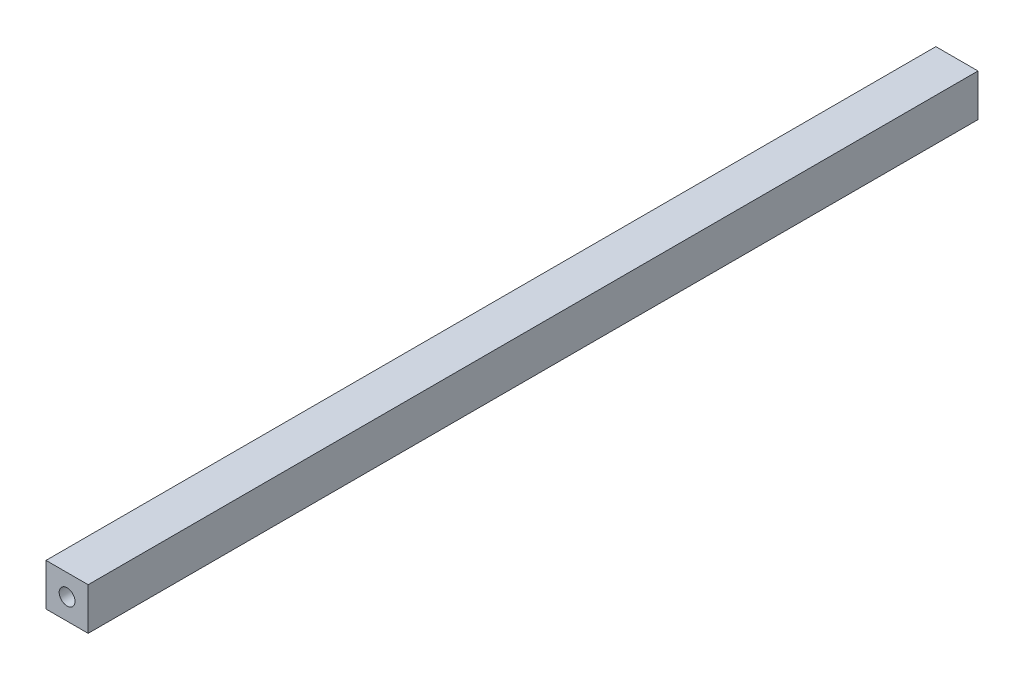
ISO-10303-21;
HEADER;
FILE_DESCRIPTION(('STEP AP214'),'2;1');
FILE_NAME('part.step','',(''),(''),'','','');
FILE_SCHEMA(('AUTOMOTIVE_DESIGN { 1 0 10303 214 1 1 1 1 }'));
ENDSEC;
DATA;
#1=APPLICATION_CONTEXT('core data for automotive mechanical design processes');
#2=APPLICATION_PROTOCOL_DEFINITION('international standard','automotive_design',2000,#1);
#3=PRODUCT_CONTEXT('',#1,'mechanical');
#4=PRODUCT('Part','Part','',(#3));
#5=PRODUCT_RELATED_PRODUCT_CATEGORY('part','',(#4));
#6=PRODUCT_DEFINITION_FORMATION('','',#4);
#7=PRODUCT_DEFINITION_CONTEXT('part definition',#1,'design');
#8=PRODUCT_DEFINITION('design','',#6,#7);
#9=PRODUCT_DEFINITION_SHAPE('','',#8);
#10=(LENGTH_UNIT() NAMED_UNIT(*) SI_UNIT(.MILLI.,.METRE.));
#11=(NAMED_UNIT(*) PLANE_ANGLE_UNIT() SI_UNIT($,.RADIAN.));
#12=(NAMED_UNIT(*) SI_UNIT($,.STERADIAN.) SOLID_ANGLE_UNIT());
#13=UNCERTAINTY_MEASURE_WITH_UNIT(LENGTH_MEASURE(1.E-05),#10,'distance_accuracy_value','');
#14=(GEOMETRIC_REPRESENTATION_CONTEXT(3) GLOBAL_UNCERTAINTY_ASSIGNED_CONTEXT((#13)) GLOBAL_UNIT_ASSIGNED_CONTEXT((#10,
#11,#12)) REPRESENTATION_CONTEXT('',''));
#15=CARTESIAN_POINT('',(0.,0.,0.));
#16=DIRECTION('',(0.,0.,1.));
#17=DIRECTION('',(1.,0.,0.));
#18=AXIS2_PLACEMENT_3D('',#15,#16,#17);
#19=CARTESIAN_POINT('',(0.,0.,536.194));
#20=DIRECTION('',(1.,0.,0.));
#21=DIRECTION('',(0.,0.,-1.));
#22=AXIS2_PLACEMENT_3D('',#19,#20,#21);
#23=PLANE('',#22);
#24=DIRECTION('',(0.,-1.,0.));
#25=VECTOR('',#24,1.);
#26=CARTESIAN_POINT('',(0.,0.,0.));
#27=LINE('',#26,#25);
#28=CARTESIAN_POINT('',(0.,25.4,0.));
#29=VERTEX_POINT('',#28);
#30=CARTESIAN_POINT('',(0.,0.,0.));
#31=VERTEX_POINT('',#30);
#32=EDGE_CURVE('E108',#29,#31,#27,.T.);
#33=ORIENTED_EDGE('',*,*,#32,.T.);
#34=DIRECTION('',(0.,0.,-1.));
#35=VECTOR('',#34,1.);
#36=CARTESIAN_POINT('',(0.,0.,536.194));
#37=LINE('',#36,#35);
#38=CARTESIAN_POINT('',(0.,0.,536.194));
#39=VERTEX_POINT('',#38);
#40=EDGE_CURVE('E11',#39,#31,#37,.T.);
#41=ORIENTED_EDGE('',*,*,#40,.F.);
#42=DIRECTION('',(0.,-1.,0.));
#43=VECTOR('',#42,1.);
#44=CARTESIAN_POINT('',(0.,0.,536.194));
#45=LINE('',#44,#43);
#46=CARTESIAN_POINT('',(0.,25.4,536.194));
#47=VERTEX_POINT('',#46);
#48=EDGE_CURVE('E109',#47,#39,#45,.T.);
#49=ORIENTED_EDGE('',*,*,#48,.F.);
#50=DIRECTION('',(0.,0.,-1.));
#51=VECTOR('',#50,1.);
#52=CARTESIAN_POINT('',(0.,25.4,536.194));
#53=LINE('',#52,#51);
#54=EDGE_CURVE('E115',#47,#29,#53,.T.);
#55=ORIENTED_EDGE('',*,*,#54,.T.);
#56=EDGE_LOOP('',(#33,#41,#49,#55));
#57=FACE_BOUND('',#56,.T.);
#58=ADVANCED_FACE('F33',(#57),#23,.F.);
#59=CARTESIAN_POINT('',(0.,0.,536.194));
#60=DIRECTION('',(0.,1.,0.));
#61=DIRECTION('',(0.,0.,1.));
#62=AXIS2_PLACEMENT_3D('',#59,#60,#61);
#63=PLANE('',#62);
#64=DIRECTION('',(1.,0.,0.));
#65=VECTOR('',#64,1.);
#66=CARTESIAN_POINT('',(0.,0.,0.));
#67=LINE('',#66,#65);
#68=CARTESIAN_POINT('',(25.4,0.,0.));
#69=VERTEX_POINT('',#68);
#70=EDGE_CURVE('E118',#31,#69,#67,.T.);
#71=ORIENTED_EDGE('',*,*,#70,.T.);
#72=DIRECTION('',(0.,0.,-1.));
#73=VECTOR('',#72,1.);
#74=CARTESIAN_POINT('',(25.4,0.,536.194));
#75=LINE('',#74,#73);
#76=CARTESIAN_POINT('',(25.4,0.,536.194));
#77=VERTEX_POINT('',#76);
#78=EDGE_CURVE('E41',#77,#69,#75,.T.);
#79=ORIENTED_EDGE('',*,*,#78,.F.);
#80=DIRECTION('',(1.,0.,0.));
#81=VECTOR('',#80,1.);
#82=CARTESIAN_POINT('',(0.,0.,536.194));
#83=LINE('',#82,#81);
#84=EDGE_CURVE('E80',#39,#77,#83,.T.);
#85=ORIENTED_EDGE('',*,*,#84,.F.);
#86=ORIENTED_EDGE('',*,*,#40,.T.);
#87=EDGE_LOOP('',(#71,#79,#85,#86));
#88=FACE_BOUND('',#87,.T.);
#89=ADVANCED_FACE('F142',(#88),#63,.F.);
#90=CARTESIAN_POINT('',(25.4,0.,536.194));
#91=DIRECTION('',(-1.,0.,0.));
#92=DIRECTION('',(0.,0.,1.));
#93=AXIS2_PLACEMENT_3D('',#90,#91,#92);
#94=PLANE('',#93);
#95=DIRECTION('',(0.,1.,0.));
#96=VECTOR('',#95,1.);
#97=CARTESIAN_POINT('',(25.4,0.,0.));
#98=LINE('',#97,#96);
#99=CARTESIAN_POINT('',(25.4,25.4,0.));
#100=VERTEX_POINT('',#99);
#101=EDGE_CURVE('E67',#69,#100,#98,.T.);
#102=ORIENTED_EDGE('',*,*,#101,.T.);
#103=DIRECTION('',(0.,0.,-1.));
#104=VECTOR('',#103,1.);
#105=CARTESIAN_POINT('',(25.4,25.4,536.194));
#106=LINE('',#105,#104);
#107=CARTESIAN_POINT('',(25.4,25.4,536.194));
#108=VERTEX_POINT('',#107);
#109=EDGE_CURVE('E123',#108,#100,#106,.T.);
#110=ORIENTED_EDGE('',*,*,#109,.F.);
#111=DIRECTION('',(0.,1.,0.));
#112=VECTOR('',#111,1.);
#113=CARTESIAN_POINT('',(25.4,0.,536.194));
#114=LINE('',#113,#112);
#115=EDGE_CURVE('E112',#77,#108,#114,.T.);
#116=ORIENTED_EDGE('',*,*,#115,.F.);
#117=ORIENTED_EDGE('',*,*,#78,.T.);
#118=EDGE_LOOP('',(#102,#110,#116,#117));
#119=FACE_BOUND('',#118,.T.);
#120=ADVANCED_FACE('F125',(#119),#94,.F.);
#121=CARTESIAN_POINT('',(0.,25.4,536.194));
#122=DIRECTION('',(0.,-1.,0.));
#123=DIRECTION('',(0.,0.,-1.));
#124=AXIS2_PLACEMENT_3D('',#121,#122,#123);
#125=PLANE('',#124);
#126=DIRECTION('',(-1.,0.,0.));
#127=VECTOR('',#126,1.);
#128=CARTESIAN_POINT('',(0.,25.4,0.));
#129=LINE('',#128,#127);
#130=EDGE_CURVE('E73',#100,#29,#129,.T.);
#131=ORIENTED_EDGE('',*,*,#130,.T.);
#132=ORIENTED_EDGE('',*,*,#54,.F.);
#133=DIRECTION('',(-1.,0.,0.));
#134=VECTOR('',#133,1.);
#135=CARTESIAN_POINT('',(0.,25.4,536.194));
#136=LINE('',#135,#134);
#137=EDGE_CURVE('E49',#108,#47,#136,.T.);
#138=ORIENTED_EDGE('',*,*,#137,.F.);
#139=ORIENTED_EDGE('',*,*,#109,.T.);
#140=EDGE_LOOP('',(#131,#132,#138,#139));
#141=FACE_BOUND('',#140,.T.);
#142=ADVANCED_FACE('F132',(#141),#125,.F.);
#143=CARTESIAN_POINT('',(0.,0.,536.194));
#144=DIRECTION('',(0.,0.,-1.));
#145=DIRECTION('',(-1.,0.,0.));
#146=AXIS2_PLACEMENT_3D('',#143,#144,#145);
#147=PLANE('',#146);
#148=CARTESIAN_POINT('',(12.7,12.7,536.194));
#149=DIRECTION('',(0.,0.,1.));
#150=DIRECTION('',(1.,0.,0.));
#151=AXIS2_PLACEMENT_3D('',#148,#149,#150);
#152=CIRCLE('',#151,4.76249999999999);
#153=CARTESIAN_POINT('',(17.4625,12.7,536.194));
#154=VERTEX_POINT('',#153);
#155=EDGE_CURVE('E98',#154,#154,#152,.T.);
#156=ORIENTED_EDGE('',*,*,#155,.F.);
#157=EDGE_LOOP('',(#156));
#158=FACE_BOUND('',#157,.T.);
#159=ORIENTED_EDGE('',*,*,#48,.T.);
#160=ORIENTED_EDGE('',*,*,#84,.T.);
#161=ORIENTED_EDGE('',*,*,#115,.T.);
#162=ORIENTED_EDGE('',*,*,#137,.T.);
#163=EDGE_LOOP('',(#159,#160,#161,#162));
#164=FACE_BOUND('',#163,.T.);
#165=ADVANCED_FACE('F134',(#158,#164),#147,.F.);
#166=CARTESIAN_POINT('',(0.,0.,0.));
#167=DIRECTION('',(0.,0.,-1.));
#168=DIRECTION('',(-1.,0.,0.));
#169=AXIS2_PLACEMENT_3D('',#166,#167,#168);
#170=PLANE('',#169);
#171=CARTESIAN_POINT('',(12.7,12.7,0.));
#172=DIRECTION('',(0.,0.,-1.));
#173=DIRECTION('',(-1.,0.,0.));
#174=AXIS2_PLACEMENT_3D('',#171,#172,#173);
#175=CIRCLE('',#174,4.76249999999999);
#176=CARTESIAN_POINT('',(7.93750000000001,12.7,0.));
#177=VERTEX_POINT('',#176);
#178=EDGE_CURVE('E97',#177,#177,#175,.T.);
#179=ORIENTED_EDGE('',*,*,#178,.F.);
#180=EDGE_LOOP('',(#179));
#181=FACE_BOUND('',#180,.T.);
#182=ORIENTED_EDGE('',*,*,#32,.F.);
#183=ORIENTED_EDGE('',*,*,#130,.F.);
#184=ORIENTED_EDGE('',*,*,#101,.F.);
#185=ORIENTED_EDGE('',*,*,#70,.F.);
#186=EDGE_LOOP('',(#182,#183,#184,#185));
#187=FACE_BOUND('',#186,.T.);
#188=ADVANCED_FACE('F128',(#181,#187),#170,.T.);
#189=CARTESIAN_POINT('',(12.7,12.7,25.4));
#190=DIRECTION('',(0.,0.,-1.));
#191=DIRECTION('',(-1.,0.,0.));
#192=AXIS2_PLACEMENT_3D('',#189,#190,#191);
#193=CONICAL_SURFACE('',#192,4.76249999999993,1.02974425867664);
#194=CARTESIAN_POINT('',(12.7,12.7,28.2615986981188));
#195=VERTEX_POINT('',#194);
#196=VERTEX_LOOP('',#195);
#197=FACE_BOUND('',#196,.T.);
#198=CARTESIAN_POINT('',(12.7,12.7,25.4));
#199=DIRECTION('',(0.,0.,-1.));
#200=DIRECTION('',(-1.,0.,0.));
#201=AXIS2_PLACEMENT_3D('',#198,#199,#200);
#202=CIRCLE('',#201,4.76249999999993);
#203=CARTESIAN_POINT('',(7.93750000000007,12.7,25.4));
#204=VERTEX_POINT('',#203);
#205=EDGE_CURVE('E101',#204,#204,#202,.T.);
#206=ORIENTED_EDGE('',*,*,#205,.T.);
#207=EDGE_LOOP('',(#206));
#208=FACE_BOUND('',#207,.T.);
#209=ADVANCED_FACE('F169',(#197,#208),#193,.F.);
#210=CARTESIAN_POINT('',(12.7,12.7,0.));
#211=DIRECTION('',(0.,0.,-1.));
#212=DIRECTION('',(-1.,0.,0.));
#213=AXIS2_PLACEMENT_3D('',#210,#211,#212);
#214=CYLINDRICAL_SURFACE('',#213,4.76249999999996);
#215=ORIENTED_EDGE('',*,*,#205,.F.);
#216=EDGE_LOOP('',(#215));
#217=FACE_BOUND('',#216,.T.);
#218=ORIENTED_EDGE('',*,*,#178,.T.);
#219=EDGE_LOOP('',(#218));
#220=FACE_BOUND('',#219,.T.);
#221=ADVANCED_FACE('F91',(#217,#220),#214,.F.);
#222=CARTESIAN_POINT('',(12.7,12.7,510.794));
#223=DIRECTION('',(0.,0.,1.));
#224=DIRECTION('',(1.,0.,0.));
#225=AXIS2_PLACEMENT_3D('',#222,#223,#224);
#226=CONICAL_SURFACE('',#225,4.76249999999999,1.02974425867665);
#227=CARTESIAN_POINT('',(12.7,12.7,507.932401301881));
#228=VERTEX_POINT('',#227);
#229=VERTEX_LOOP('',#228);
#230=FACE_BOUND('',#229,.T.);
#231=CARTESIAN_POINT('',(12.7,12.7,510.794));
#232=DIRECTION('',(0.,0.,1.));
#233=DIRECTION('',(1.,0.,0.));
#234=AXIS2_PLACEMENT_3D('',#231,#232,#233);
#235=CIRCLE('',#234,4.76249999999999);
#236=CARTESIAN_POINT('',(17.4625,12.7,510.794));
#237=VERTEX_POINT('',#236);
#238=EDGE_CURVE('E95',#237,#237,#235,.T.);
#239=ORIENTED_EDGE('',*,*,#238,.T.);
#240=EDGE_LOOP('',(#239));
#241=FACE_BOUND('',#240,.T.);
#242=ADVANCED_FACE('F87',(#230,#241),#226,.F.);
#243=CARTESIAN_POINT('',(12.7,12.7,536.194));
#244=DIRECTION('',(0.,0.,1.));
#245=DIRECTION('',(1.,0.,0.));
#246=AXIS2_PLACEMENT_3D('',#243,#244,#245);
#247=CYLINDRICAL_SURFACE('',#246,4.76249999999999);
#248=ORIENTED_EDGE('',*,*,#238,.F.);
#249=EDGE_LOOP('',(#248));
#250=FACE_BOUND('',#249,.T.);
#251=ORIENTED_EDGE('',*,*,#155,.T.);
#252=EDGE_LOOP('',(#251));
#253=FACE_BOUND('',#252,.T.);
#254=ADVANCED_FACE('F90',(#250,#253),#247,.F.);
#255=CLOSED_SHELL('',(#58,#89,#120,#142,#165,#188,#209,#221,#242,#254));
#256=MANIFOLD_SOLID_BREP('B2',#255);
#257=ADVANCED_BREP_SHAPE_REPRESENTATION('',(#18,#256),#14);
#258=SHAPE_DEFINITION_REPRESENTATION(#9,#257);
ENDSEC;
END-ISO-10303-21;
